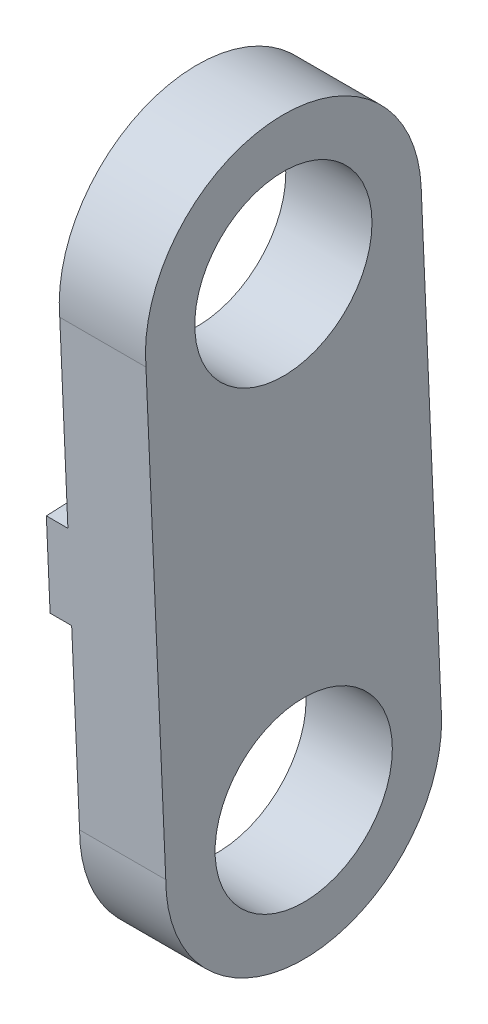
ISO-10303-21;
HEADER;
FILE_DESCRIPTION(('STEP AP214'),'2;1');
FILE_NAME('part.step','',(''),(''),'','','');
FILE_SCHEMA(('AUTOMOTIVE_DESIGN { 1 0 10303 214 1 1 1 1 }'));
ENDSEC;
DATA;
#1=APPLICATION_CONTEXT('core data for automotive mechanical design processes');
#2=APPLICATION_PROTOCOL_DEFINITION('international standard','automotive_design',2000,#1);
#3=PRODUCT_CONTEXT('',#1,'mechanical');
#4=PRODUCT('Part','Part','',(#3));
#5=PRODUCT_RELATED_PRODUCT_CATEGORY('part','',(#4));
#6=PRODUCT_DEFINITION_FORMATION('','',#4);
#7=PRODUCT_DEFINITION_CONTEXT('part definition',#1,'design');
#8=PRODUCT_DEFINITION('design','',#6,#7);
#9=PRODUCT_DEFINITION_SHAPE('','',#8);
#10=(LENGTH_UNIT() NAMED_UNIT(*) SI_UNIT(.MILLI.,.METRE.));
#11=(NAMED_UNIT(*) PLANE_ANGLE_UNIT() SI_UNIT($,.RADIAN.));
#12=(NAMED_UNIT(*) SI_UNIT($,.STERADIAN.) SOLID_ANGLE_UNIT());
#13=UNCERTAINTY_MEASURE_WITH_UNIT(LENGTH_MEASURE(1.E-05),#10,'distance_accuracy_value','');
#14=(GEOMETRIC_REPRESENTATION_CONTEXT(3) GLOBAL_UNCERTAINTY_ASSIGNED_CONTEXT((#13)) GLOBAL_UNIT_ASSIGNED_CONTEXT((#10,
#11,#12)) REPRESENTATION_CONTEXT('',''));
#15=CARTESIAN_POINT('',(0.,0.,0.));
#16=DIRECTION('',(0.,0.,1.));
#17=DIRECTION('',(1.,0.,0.));
#18=AXIS2_PLACEMENT_3D('',#15,#16,#17);
#19=CARTESIAN_POINT('',(0.,17.1566079598765,-196.10092631936));
#20=DIRECTION('',(1.,0.,0.));
#21=DIRECTION('',(0.,0.,-1.));
#22=AXIS2_PLACEMENT_3D('',#19,#20,#21);
#23=PLANE('',#22);
#24=CARTESIAN_POINT('',(0.,17.1566079598765,-196.10092631936));
#25=DIRECTION('',(1.,0.,0.));
#26=DIRECTION('',(0.,0.,-1.));
#27=AXIS2_PLACEMENT_3D('',#24,#25,#26);
#28=CIRCLE('',#27,3.26389999999998);
#29=CARTESIAN_POINT('',(0.,17.1566079598765,-199.36482631936));
#30=VERTEX_POINT('',#29);
#31=EDGE_CURVE('E125',#30,#30,#28,.T.);
#32=ORIENTED_EDGE('',*,*,#31,.T.);
#33=EDGE_LOOP('',(#32));
#34=FACE_BOUND('',#33,.T.);
#35=DIRECTION('',(0.,0.0433416762051664,-0.999060308041375));
#36=VECTOR('',#35,1.);
#37=CARTESIAN_POINT('',(0.,9.83434384528371,-191.340623274828));
#38=LINE('',#37,#36);
#39=CARTESIAN_POINT('',(0.,9.83434384528371,-191.340623274828));
#40=VERTEX_POINT('',#39);
#41=CARTESIAN_POINT('',(0.,10.2744000765151,-201.484271431129));
#42=VERTEX_POINT('',#41);
#43=EDGE_CURVE('E55',#40,#42,#38,.T.);
#44=ORIENTED_EDGE('',*,*,#43,.F.);
#45=DIRECTION('',(0.,-0.999048221581858,-0.0436193873653357));
#46=VECTOR('',#45,1.);
#47=CARTESIAN_POINT('',(0.,16.7138567867184,-191.040257253054));
#48=LINE('',#47,#46);
#49=CARTESIAN_POINT('',(0.,16.7138567867184,-191.040257253054));
#50=VERTEX_POINT('',#49);
#51=EDGE_CURVE('E187',#50,#40,#48,.T.);
#52=ORIENTED_EDGE('',*,*,#51,.F.);
#53=CARTESIAN_POINT('',(0.,17.1566079598765,-196.10092631936));
#54=DIRECTION('',(1.,0.,0.));
#55=DIRECTION('',(0.,0.,-1.));
#56=AXIS2_PLACEMENT_3D('',#53,#54,#55);
#57=CIRCLE('',#56,5.08);
#58=CARTESIAN_POINT('',(0.,17.3767836749988,-201.17615268421));
#59=VERTEX_POINT('',#58);
#60=EDGE_CURVE('E165',#59,#50,#57,.T.);
#61=ORIENTED_EDGE('',*,*,#60,.F.);
#62=DIRECTION('',(0.,0.999060308041374,0.0433416762051666));
#63=VECTOR('',#62,1.);
#64=CARTESIAN_POINT('',(0.,17.3767836749988,-201.17615268421));
#65=LINE('',#64,#63);
#66=EDGE_CURVE('E60',#42,#59,#65,.T.);
#67=ORIENTED_EDGE('',*,*,#66,.F.);
#68=EDGE_LOOP('',(#44,#52,#61,#67));
#69=FACE_BOUND('',#68,.T.);
#70=ADVANCED_FACE('F39',(#34,#69),#23,.F.);
#71=CARTESIAN_POINT('',(0.,0.,-196.85));
#72=DIRECTION('',(1.,0.,0.));
#73=DIRECTION('',(0.,0.,-1.));
#74=AXIS2_PLACEMENT_3D('',#71,#72,#73);
#75=CIRCLE('',#74,3.26390000000001);
#76=CARTESIAN_POINT('',(0.,0.,-200.1139));
#77=VERTEX_POINT('',#76);
#78=EDGE_CURVE('E157',#77,#77,#75,.T.);
#79=ORIENTED_EDGE('',*,*,#78,.T.);
#80=EDGE_LOOP('',(#79));
#81=FACE_BOUND('',#80,.T.);
#82=DIRECTION('',(0.,-0.0436267261494994,0.999047901136615));
#83=VECTOR('',#82,1.);
#84=CARTESIAN_POINT('',(0.,7.10238359848371,-201.621881253081));
#85=LINE('',#84,#83);
#86=CARTESIAN_POINT('',(0.,7.10238359848371,-201.621881253081));
#87=VERTEX_POINT('',#86);
#88=CARTESIAN_POINT('',(0.,6.65947172192155,-191.479241185348));
#89=VERTEX_POINT('',#88);
#90=EDGE_CURVE('E140',#87,#89,#85,.T.);
#91=ORIENTED_EDGE('',*,*,#90,.F.);
#92=CARTESIAN_POINT('',(0.,0.,-201.93));
#93=VERTEX_POINT('',#92);
#94=EDGE_CURVE('E121',#93,#87,#65,.T.);
#95=ORIENTED_EDGE('',*,*,#94,.F.);
#96=CARTESIAN_POINT('',(0.,0.,-196.85));
#97=DIRECTION('',(1.,0.,0.));
#98=DIRECTION('',(0.,0.,-1.));
#99=AXIS2_PLACEMENT_3D('',#96,#97,#98);
#100=CIRCLE('',#99,5.08);
#101=CARTESIAN_POINT('',(0.,0.,-191.77));
#102=VERTEX_POINT('',#101);
#103=EDGE_CURVE('E190',#102,#93,#100,.T.);
#104=ORIENTED_EDGE('',*,*,#103,.F.);
#105=EDGE_CURVE('E186',#89,#102,#48,.T.);
#106=ORIENTED_EDGE('',*,*,#105,.F.);
#107=EDGE_LOOP('',(#91,#95,#104,#106));
#108=FACE_BOUND('',#107,.T.);
#109=ADVANCED_FACE('F210',(#81,#108),#23,.F.);
#110=CARTESIAN_POINT('',(3.175,17.1566079598765,-196.10092631936));
#111=DIRECTION('',(1.,0.,0.));
#112=DIRECTION('',(0.,0.,-1.));
#113=AXIS2_PLACEMENT_3D('',#110,#111,#112);
#114=PLANE('',#113);
#115=CARTESIAN_POINT('',(3.175,0.,-196.85));
#116=DIRECTION('',(1.,0.,0.));
#117=DIRECTION('',(0.,0.,-1.));
#118=AXIS2_PLACEMENT_3D('',#115,#116,#117);
#119=CIRCLE('',#118,3.26390000000001);
#120=CARTESIAN_POINT('',(3.175,0.,-200.1139));
#121=VERTEX_POINT('',#120);
#122=EDGE_CURVE('E161',#121,#121,#119,.T.);
#123=ORIENTED_EDGE('',*,*,#122,.F.);
#124=EDGE_LOOP('',(#123));
#125=FACE_BOUND('',#124,.T.);
#126=CARTESIAN_POINT('',(3.175,17.1566079598765,-196.10092631936));
#127=DIRECTION('',(1.,0.,0.));
#128=DIRECTION('',(0.,0.,-1.));
#129=AXIS2_PLACEMENT_3D('',#126,#127,#128);
#130=CIRCLE('',#129,5.08);
#131=CARTESIAN_POINT('',(3.175,17.3767836749988,-201.17615268421));
#132=VERTEX_POINT('',#131);
#133=CARTESIAN_POINT('',(3.175,16.7138567867184,-191.040257253054));
#134=VERTEX_POINT('',#133);
#135=EDGE_CURVE('E169',#132,#134,#130,.T.);
#136=ORIENTED_EDGE('',*,*,#135,.T.);
#137=DIRECTION('',(0.,-0.999048221581858,-0.0436193873653357));
#138=VECTOR('',#137,1.);
#139=CARTESIAN_POINT('',(3.175,16.7138567867184,-191.040257253054));
#140=LINE('',#139,#138);
#141=CARTESIAN_POINT('',(3.175,0.,-191.77));
#142=VERTEX_POINT('',#141);
#143=EDGE_CURVE('E173',#134,#142,#140,.T.);
#144=ORIENTED_EDGE('',*,*,#143,.T.);
#145=CARTESIAN_POINT('',(3.175,0.,-196.85));
#146=DIRECTION('',(1.,0.,0.));
#147=DIRECTION('',(0.,0.,-1.));
#148=AXIS2_PLACEMENT_3D('',#145,#146,#147);
#149=CIRCLE('',#148,5.08);
#150=CARTESIAN_POINT('',(3.175,0.,-201.93));
#151=VERTEX_POINT('',#150);
#152=EDGE_CURVE('E176',#142,#151,#149,.T.);
#153=ORIENTED_EDGE('',*,*,#152,.T.);
#154=DIRECTION('',(0.,0.999060308041374,0.0433416762051666));
#155=VECTOR('',#154,1.);
#156=CARTESIAN_POINT('',(3.175,17.3767836749988,-201.17615268421));
#157=LINE('',#156,#155);
#158=EDGE_CURVE('E179',#151,#132,#157,.T.);
#159=ORIENTED_EDGE('',*,*,#158,.T.);
#160=EDGE_LOOP('',(#136,#144,#153,#159));
#161=FACE_BOUND('',#160,.T.);
#162=CARTESIAN_POINT('',(3.175,17.1566079598765,-196.10092631936));
#163=DIRECTION('',(1.,0.,0.));
#164=DIRECTION('',(0.,0.,-1.));
#165=AXIS2_PLACEMENT_3D('',#162,#163,#164);
#166=CIRCLE('',#165,3.26389999999998);
#167=CARTESIAN_POINT('',(3.175,17.1566079598765,-199.36482631936));
#168=VERTEX_POINT('',#167);
#169=EDGE_CURVE('E153',#168,#168,#166,.T.);
#170=ORIENTED_EDGE('',*,*,#169,.F.);
#171=EDGE_LOOP('',(#170));
#172=FACE_BOUND('',#171,.T.);
#173=ADVANCED_FACE('F222',(#125,#161,#172),#114,.T.);
#174=CARTESIAN_POINT('',(3.175,17.1566079598765,-196.10092631936));
#175=DIRECTION('',(-1.,0.,0.));
#176=DIRECTION('',(0.,0.,1.));
#177=AXIS2_PLACEMENT_3D('',#174,#175,#176);
#178=CYLINDRICAL_SURFACE('',#177,5.08);
#179=ORIENTED_EDGE('',*,*,#60,.T.);
#180=DIRECTION('',(-1.,0.,0.));
#181=VECTOR('',#180,1.);
#182=CARTESIAN_POINT('',(3.175,16.7138567867184,-191.040257253054));
#183=LINE('',#182,#181);
#184=EDGE_CURVE('E11',#134,#50,#183,.T.);
#185=ORIENTED_EDGE('',*,*,#184,.F.);
#186=ORIENTED_EDGE('',*,*,#135,.F.);
#187=DIRECTION('',(-1.,0.,0.));
#188=VECTOR('',#187,1.);
#189=CARTESIAN_POINT('',(3.175,17.3767836749988,-201.17615268421));
#190=LINE('',#189,#188);
#191=EDGE_CURVE('E182',#132,#59,#190,.T.);
#192=ORIENTED_EDGE('',*,*,#191,.T.);
#193=EDGE_LOOP('',(#179,#185,#186,#192));
#194=FACE_BOUND('',#193,.T.);
#195=ADVANCED_FACE('F41',(#194),#178,.T.);
#196=CARTESIAN_POINT('',(3.175,16.7138567867184,-191.040257253054));
#197=DIRECTION('',(0.,0.0436193873653357,-0.999048221581858));
#198=DIRECTION('',(0.,0.999048221581858,0.0436193873653357));
#199=AXIS2_PLACEMENT_3D('',#196,#197,#198);
#200=PLANE('',#199);
#201=ORIENTED_EDGE('',*,*,#51,.T.);
#202=DIRECTION('',(1.,0.,0.));
#203=VECTOR('',#202,1.);
#204=CARTESIAN_POINT('',(-0.79375,9.83434384528371,-191.340623274828));
#205=LINE('',#204,#203);
#206=CARTESIAN_POINT('',(-0.79375,9.83434384528371,-191.340623274828));
#207=VERTEX_POINT('',#206);
#208=EDGE_CURVE('E147',#207,#40,#205,.T.);
#209=ORIENTED_EDGE('',*,*,#208,.F.);
#210=DIRECTION('',(0.,0.999048221581858,0.043619387365337));
#211=VECTOR('',#210,1.);
#212=CARTESIAN_POINT('',(-0.79375,6.65947172192155,-191.479241185348));
#213=LINE('',#212,#211);
#214=CARTESIAN_POINT('',(-0.79375,6.65947172192155,-191.479241185348));
#215=VERTEX_POINT('',#214);
#216=EDGE_CURVE('E132',#215,#207,#213,.T.);
#217=ORIENTED_EDGE('',*,*,#216,.F.);
#218=DIRECTION('',(1.,0.,0.));
#219=VECTOR('',#218,1.);
#220=CARTESIAN_POINT('',(-0.79375,6.65947172192155,-191.479241185348));
#221=LINE('',#220,#219);
#222=EDGE_CURVE('E126',#215,#89,#221,.T.);
#223=ORIENTED_EDGE('',*,*,#222,.T.);
#224=ORIENTED_EDGE('',*,*,#105,.T.);
#225=DIRECTION('',(-1.,0.,0.));
#226=VECTOR('',#225,1.);
#227=CARTESIAN_POINT('',(3.175,0.,-191.77));
#228=LINE('',#227,#226);
#229=EDGE_CURVE('E48',#142,#102,#228,.T.);
#230=ORIENTED_EDGE('',*,*,#229,.F.);
#231=ORIENTED_EDGE('',*,*,#143,.F.);
#232=ORIENTED_EDGE('',*,*,#184,.T.);
#233=EDGE_LOOP('',(#201,#209,#217,#223,#224,#230,#231,#232));
#234=FACE_BOUND('',#233,.T.);
#235=ADVANCED_FACE('F211',(#234),#200,.F.);
#236=CARTESIAN_POINT('',(3.175,0.,-196.85));
#237=DIRECTION('',(-1.,0.,0.));
#238=DIRECTION('',(0.,0.,1.));
#239=AXIS2_PLACEMENT_3D('',#236,#237,#238);
#240=CYLINDRICAL_SURFACE('',#239,5.08);
#241=ORIENTED_EDGE('',*,*,#103,.T.);
#242=DIRECTION('',(-1.,0.,0.));
#243=VECTOR('',#242,1.);
#244=CARTESIAN_POINT('',(3.175,0.,-201.93));
#245=LINE('',#244,#243);
#246=EDGE_CURVE('E198',#151,#93,#245,.T.);
#247=ORIENTED_EDGE('',*,*,#246,.F.);
#248=ORIENTED_EDGE('',*,*,#152,.F.);
#249=ORIENTED_EDGE('',*,*,#229,.T.);
#250=EDGE_LOOP('',(#241,#247,#248,#249));
#251=FACE_BOUND('',#250,.T.);
#252=ADVANCED_FACE('F206',(#251),#240,.T.);
#253=CARTESIAN_POINT('',(3.175,17.3767836749988,-201.17615268421));
#254=DIRECTION('',(0.,-0.0433416762051667,0.999060308041375));
#255=DIRECTION('',(0.,-0.999060308041375,-0.0433416762051667));
#256=AXIS2_PLACEMENT_3D('',#253,#254,#255);
#257=PLANE('',#256);
#258=ORIENTED_EDGE('',*,*,#94,.T.);
#259=DIRECTION('',(1.,0.,0.));
#260=VECTOR('',#259,1.);
#261=CARTESIAN_POINT('',(-0.79375,7.10238359848371,-201.621881253081));
#262=LINE('',#261,#260);
#263=CARTESIAN_POINT('',(-0.79375,7.10238359848371,-201.621881253081));
#264=VERTEX_POINT('',#263);
#265=EDGE_CURVE('E117',#264,#87,#262,.T.);
#266=ORIENTED_EDGE('',*,*,#265,.F.);
#267=DIRECTION('',(0.,-0.999060308041375,-0.0433416762051587));
#268=VECTOR('',#267,1.);
#269=CARTESIAN_POINT('',(-0.79375,10.2744000765151,-201.484271431129));
#270=LINE('',#269,#268);
#271=CARTESIAN_POINT('',(-0.79375,10.2744000765151,-201.484271431129));
#272=VERTEX_POINT('',#271);
#273=EDGE_CURVE('E102',#272,#264,#270,.T.);
#274=ORIENTED_EDGE('',*,*,#273,.F.);
#275=DIRECTION('',(1.,0.,0.));
#276=VECTOR('',#275,1.);
#277=CARTESIAN_POINT('',(-0.79375,10.2744000765151,-201.484271431129));
#278=LINE('',#277,#276);
#279=EDGE_CURVE('E139',#272,#42,#278,.T.);
#280=ORIENTED_EDGE('',*,*,#279,.T.);
#281=ORIENTED_EDGE('',*,*,#66,.T.);
#282=ORIENTED_EDGE('',*,*,#191,.F.);
#283=ORIENTED_EDGE('',*,*,#158,.F.);
#284=ORIENTED_EDGE('',*,*,#246,.T.);
#285=EDGE_LOOP('',(#258,#266,#274,#280,#281,#282,#283,#284));
#286=FACE_BOUND('',#285,.T.);
#287=ADVANCED_FACE('F118',(#286),#257,.F.);
#288=CARTESIAN_POINT('',(3.175,0.,-196.85));
#289=DIRECTION('',(-1.,0.,0.));
#290=DIRECTION('',(0.,0.,1.));
#291=AXIS2_PLACEMENT_3D('',#288,#289,#290);
#292=CYLINDRICAL_SURFACE('',#291,3.26390000000001);
#293=ORIENTED_EDGE('',*,*,#122,.T.);
#294=EDGE_LOOP('',(#293));
#295=FACE_BOUND('',#294,.T.);
#296=ORIENTED_EDGE('',*,*,#78,.F.);
#297=EDGE_LOOP('',(#296));
#298=FACE_BOUND('',#297,.T.);
#299=ADVANCED_FACE('F232',(#295,#298),#292,.F.);
#300=CARTESIAN_POINT('',(3.175,17.1566079598765,-196.10092631936));
#301=DIRECTION('',(-1.,0.,0.));
#302=DIRECTION('',(0.,0.,1.));
#303=AXIS2_PLACEMENT_3D('',#300,#301,#302);
#304=CYLINDRICAL_SURFACE('',#303,3.26389999999998);
#305=ORIENTED_EDGE('',*,*,#169,.T.);
#306=EDGE_LOOP('',(#305));
#307=FACE_BOUND('',#306,.T.);
#308=ORIENTED_EDGE('',*,*,#31,.F.);
#309=EDGE_LOOP('',(#308));
#310=FACE_BOUND('',#309,.T.);
#311=ADVANCED_FACE('F229',(#307,#310),#304,.F.);
#312=CARTESIAN_POINT('',(-0.79375,7.10238359848371,-201.621881253081));
#313=DIRECTION('',(0.,0.999047901136615,0.0436267261494994));
#314=DIRECTION('',(0.,-0.0436267261494994,0.999047901136615));
#315=AXIS2_PLACEMENT_3D('',#312,#313,#314);
#316=PLANE('',#315);
#317=ORIENTED_EDGE('',*,*,#90,.T.);
#318=ORIENTED_EDGE('',*,*,#222,.F.);
#319=DIRECTION('',(0.,-0.0436267261494994,0.999047901136615));
#320=VECTOR('',#319,1.);
#321=CARTESIAN_POINT('',(-0.79375,7.10238359848371,-201.621881253081));
#322=LINE('',#321,#320);
#323=EDGE_CURVE('E106',#264,#215,#322,.T.);
#324=ORIENTED_EDGE('',*,*,#323,.F.);
#325=ORIENTED_EDGE('',*,*,#265,.T.);
#326=EDGE_LOOP('',(#317,#318,#324,#325));
#327=FACE_BOUND('',#326,.T.);
#328=ADVANCED_FACE('F128',(#327),#316,.F.);
#329=CARTESIAN_POINT('',(-0.79375,9.83434384528371,-191.340623274828));
#330=DIRECTION('',(0.,-0.999060308041375,-0.0433416762051664));
#331=DIRECTION('',(0.,0.0433416762051664,-0.999060308041375));
#332=AXIS2_PLACEMENT_3D('',#329,#330,#331);
#333=PLANE('',#332);
#334=ORIENTED_EDGE('',*,*,#43,.T.);
#335=ORIENTED_EDGE('',*,*,#279,.F.);
#336=DIRECTION('',(0.,0.0433416762051664,-0.999060308041375));
#337=VECTOR('',#336,1.);
#338=CARTESIAN_POINT('',(-0.79375,9.83434384528371,-191.340623274828));
#339=LINE('',#338,#337);
#340=EDGE_CURVE('E109',#207,#272,#339,.T.);
#341=ORIENTED_EDGE('',*,*,#340,.F.);
#342=ORIENTED_EDGE('',*,*,#208,.T.);
#343=EDGE_LOOP('',(#334,#335,#341,#342));
#344=FACE_BOUND('',#343,.T.);
#345=ADVANCED_FACE('F214',(#344),#333,.F.);
#346=CARTESIAN_POINT('',(-0.79375,0.,0.));
#347=DIRECTION('',(1.,0.,0.));
#348=DIRECTION('',(0.,0.,-1.));
#349=AXIS2_PLACEMENT_3D('',#346,#347,#348);
#350=PLANE('',#349);
#351=ORIENTED_EDGE('',*,*,#273,.T.);
#352=ORIENTED_EDGE('',*,*,#323,.T.);
#353=ORIENTED_EDGE('',*,*,#216,.T.);
#354=ORIENTED_EDGE('',*,*,#340,.T.);
#355=EDGE_LOOP('',(#351,#352,#353,#354));
#356=FACE_BOUND('',#355,.T.);
#357=ADVANCED_FACE('F104',(#356),#350,.F.);
#358=CLOSED_SHELL('',(#70,#109,#173,#195,#235,#252,#287,#299,#311,#328,#345,#357));
#359=MANIFOLD_SOLID_BREP('B2',#358);
#360=ADVANCED_BREP_SHAPE_REPRESENTATION('',(#18,#359),#14);
#361=SHAPE_DEFINITION_REPRESENTATION(#9,#360);
ENDSEC;
END-ISO-10303-21;
